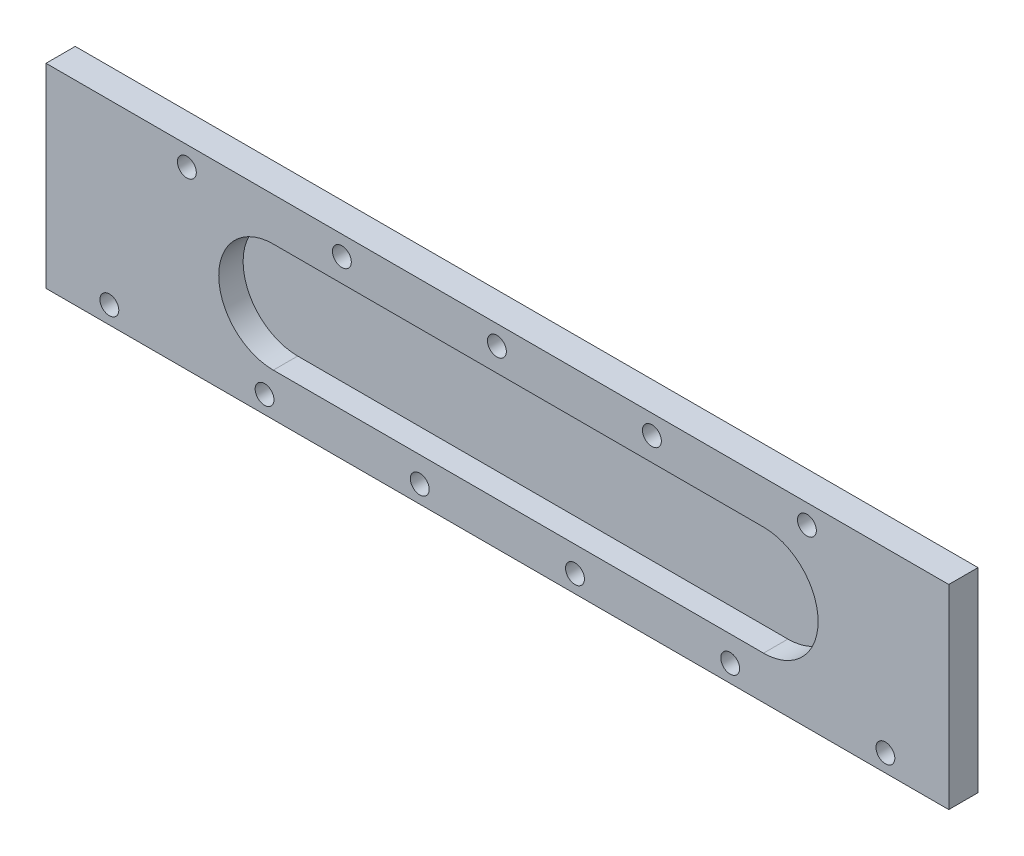
ISO-10303-21;
HEADER;
FILE_DESCRIPTION(('STEP AP214'),'2;1');
FILE_NAME('part.step','',(''),(''),'','','');
FILE_SCHEMA(('AUTOMOTIVE_DESIGN { 1 0 10303 214 1 1 1 1 }'));
ENDSEC;
DATA;
#1=APPLICATION_CONTEXT('core data for automotive mechanical design processes');
#2=APPLICATION_PROTOCOL_DEFINITION('international standard','automotive_design',2000,#1);
#3=PRODUCT_CONTEXT('',#1,'mechanical');
#4=PRODUCT('Part','Part','',(#3));
#5=PRODUCT_RELATED_PRODUCT_CATEGORY('part','',(#4));
#6=PRODUCT_DEFINITION_FORMATION('','',#4);
#7=PRODUCT_DEFINITION_CONTEXT('part definition',#1,'design');
#8=PRODUCT_DEFINITION('design','',#6,#7);
#9=PRODUCT_DEFINITION_SHAPE('','',#8);
#10=(LENGTH_UNIT() NAMED_UNIT(*) SI_UNIT(.MILLI.,.METRE.));
#11=(NAMED_UNIT(*) PLANE_ANGLE_UNIT() SI_UNIT($,.RADIAN.));
#12=(NAMED_UNIT(*) SI_UNIT($,.STERADIAN.) SOLID_ANGLE_UNIT());
#13=UNCERTAINTY_MEASURE_WITH_UNIT(LENGTH_MEASURE(1.E-05),#10,'distance_accuracy_value','');
#14=(GEOMETRIC_REPRESENTATION_CONTEXT(3) GLOBAL_UNCERTAINTY_ASSIGNED_CONTEXT((#13)) GLOBAL_UNIT_ASSIGNED_CONTEXT((#10,
#11,#12)) REPRESENTATION_CONTEXT('',''));
#15=CARTESIAN_POINT('',(0.,0.,0.));
#16=DIRECTION('',(0.,0.,1.));
#17=DIRECTION('',(1.,0.,0.));
#18=AXIS2_PLACEMENT_3D('',#15,#16,#17);
#19=CARTESIAN_POINT('',(0.,0.,7.62));
#20=DIRECTION('',(-1.,0.,0.));
#21=DIRECTION('',(0.,0.,1.));
#22=AXIS2_PLACEMENT_3D('',#19,#20,#21);
#23=PLANE('',#22);
#24=DIRECTION('',(0.,1.,0.));
#25=VECTOR('',#24,1.);
#26=CARTESIAN_POINT('',(0.,0.,0.));
#27=LINE('',#26,#25);
#28=CARTESIAN_POINT('',(0.,0.,0.));
#29=VERTEX_POINT('',#28);
#30=CARTESIAN_POINT('',(0.,50.8,0.));
#31=VERTEX_POINT('',#30);
#32=EDGE_CURVE('E143',#29,#31,#27,.T.);
#33=ORIENTED_EDGE('',*,*,#32,.T.);
#34=DIRECTION('',(0.,0.,-1.));
#35=VECTOR('',#34,1.);
#36=CARTESIAN_POINT('',(0.,50.8,7.62));
#37=LINE('',#36,#35);
#38=CARTESIAN_POINT('',(0.,50.8,7.62));
#39=VERTEX_POINT('',#38);
#40=EDGE_CURVE('E11',#39,#31,#37,.T.);
#41=ORIENTED_EDGE('',*,*,#40,.F.);
#42=DIRECTION('',(0.,1.,0.));
#43=VECTOR('',#42,1.);
#44=CARTESIAN_POINT('',(0.,0.,7.62));
#45=LINE('',#44,#43);
#46=CARTESIAN_POINT('',(0.,0.,7.62));
#47=VERTEX_POINT('',#46);
#48=EDGE_CURVE('E147',#47,#39,#45,.T.);
#49=ORIENTED_EDGE('',*,*,#48,.F.);
#50=DIRECTION('',(0.,0.,-1.));
#51=VECTOR('',#50,1.);
#52=CARTESIAN_POINT('',(0.,0.,7.62));
#53=LINE('',#52,#51);
#54=EDGE_CURVE('E153',#47,#29,#53,.T.);
#55=ORIENTED_EDGE('',*,*,#54,.T.);
#56=EDGE_LOOP('',(#33,#41,#49,#55));
#57=FACE_BOUND('',#56,.T.);
#58=ADVANCED_FACE('F32',(#57),#23,.F.);
#59=CARTESIAN_POINT('',(0.,50.8,7.62));
#60=DIRECTION('',(0.,-1.,0.));
#61=DIRECTION('',(1.,0.,0.));
#62=AXIS2_PLACEMENT_3D('',#59,#60,#61);
#63=PLANE('',#62);
#64=DIRECTION('',(-1.,0.,0.));
#65=VECTOR('',#64,1.);
#66=CARTESIAN_POINT('',(0.,50.8,0.));
#67=LINE('',#66,#65);
#68=CARTESIAN_POINT('',(-235.204,50.8,0.));
#69=VERTEX_POINT('',#68);
#70=EDGE_CURVE('E156',#31,#69,#67,.T.);
#71=ORIENTED_EDGE('',*,*,#70,.T.);
#72=DIRECTION('',(0.,0.,-1.));
#73=VECTOR('',#72,1.);
#74=CARTESIAN_POINT('',(-235.204,50.8,7.62));
#75=LINE('',#74,#73);
#76=CARTESIAN_POINT('',(-235.204,50.8,7.62));
#77=VERTEX_POINT('',#76);
#78=EDGE_CURVE('E39',#77,#69,#75,.T.);
#79=ORIENTED_EDGE('',*,*,#78,.F.);
#80=DIRECTION('',(-1.,0.,0.));
#81=VECTOR('',#80,1.);
#82=CARTESIAN_POINT('',(0.,50.8,7.62));
#83=LINE('',#82,#81);
#84=EDGE_CURVE('E83',#39,#77,#83,.T.);
#85=ORIENTED_EDGE('',*,*,#84,.F.);
#86=ORIENTED_EDGE('',*,*,#40,.T.);
#87=EDGE_LOOP('',(#71,#79,#85,#86));
#88=FACE_BOUND('',#87,.T.);
#89=ADVANCED_FACE('F185',(#88),#63,.F.);
#90=CARTESIAN_POINT('',(-235.204,0.,7.62));
#91=DIRECTION('',(1.,0.,0.));
#92=DIRECTION('',(0.,0.,-1.));
#93=AXIS2_PLACEMENT_3D('',#90,#91,#92);
#94=PLANE('',#93);
#95=DIRECTION('',(0.,-1.,0.));
#96=VECTOR('',#95,1.);
#97=CARTESIAN_POINT('',(-235.204,0.,0.));
#98=LINE('',#97,#96);
#99=CARTESIAN_POINT('',(-235.204,0.,0.));
#100=VERTEX_POINT('',#99);
#101=EDGE_CURVE('E158',#69,#100,#98,.T.);
#102=ORIENTED_EDGE('',*,*,#101,.T.);
#103=DIRECTION('',(0.,0.,-1.));
#104=VECTOR('',#103,1.);
#105=CARTESIAN_POINT('',(-235.204,0.,7.62));
#106=LINE('',#105,#104);
#107=CARTESIAN_POINT('',(-235.204,0.,7.62));
#108=VERTEX_POINT('',#107);
#109=EDGE_CURVE('E162',#108,#100,#106,.T.);
#110=ORIENTED_EDGE('',*,*,#109,.F.);
#111=DIRECTION('',(0.,-1.,0.));
#112=VECTOR('',#111,1.);
#113=CARTESIAN_POINT('',(-235.204,0.,7.62));
#114=LINE('',#113,#112);
#115=EDGE_CURVE('E150',#77,#108,#114,.T.);
#116=ORIENTED_EDGE('',*,*,#115,.F.);
#117=ORIENTED_EDGE('',*,*,#78,.T.);
#118=EDGE_LOOP('',(#102,#110,#116,#117));
#119=FACE_BOUND('',#118,.T.);
#120=ADVANCED_FACE('F167',(#119),#94,.F.);
#121=CARTESIAN_POINT('',(0.,0.,7.62));
#122=DIRECTION('',(0.,1.,0.));
#123=DIRECTION('',(-1.,0.,0.));
#124=AXIS2_PLACEMENT_3D('',#121,#122,#123);
#125=PLANE('',#124);
#126=DIRECTION('',(1.,0.,0.));
#127=VECTOR('',#126,1.);
#128=CARTESIAN_POINT('',(0.,0.,0.));
#129=LINE('',#128,#127);
#130=EDGE_CURVE('E76',#100,#29,#129,.T.);
#131=ORIENTED_EDGE('',*,*,#130,.T.);
#132=ORIENTED_EDGE('',*,*,#54,.F.);
#133=DIRECTION('',(1.,0.,0.));
#134=VECTOR('',#133,1.);
#135=CARTESIAN_POINT('',(0.,0.,7.62));
#136=LINE('',#135,#134);
#137=EDGE_CURVE('E55',#108,#47,#136,.T.);
#138=ORIENTED_EDGE('',*,*,#137,.F.);
#139=ORIENTED_EDGE('',*,*,#109,.T.);
#140=EDGE_LOOP('',(#131,#132,#138,#139));
#141=FACE_BOUND('',#140,.T.);
#142=ADVANCED_FACE('F175',(#141),#125,.F.);
#143=CARTESIAN_POINT('',(0.,0.,7.62));
#144=DIRECTION('',(0.,0.,1.));
#145=DIRECTION('',(1.,0.,0.));
#146=AXIS2_PLACEMENT_3D('',#143,#144,#145);
#147=PLANE('',#146);
#148=CARTESIAN_POINT('',(-198.501,45.72,7.62));
#149=DIRECTION('',(0.,0.,1.));
#150=DIRECTION('',(1.,0.,0.));
#151=AXIS2_PLACEMENT_3D('',#148,#149,#150);
#152=CIRCLE('',#151,2.45745);
#153=CARTESIAN_POINT('',(-196.04355,45.72,7.62));
#154=VERTEX_POINT('',#153);
#155=EDGE_CURVE('E380',#154,#154,#152,.T.);
#156=ORIENTED_EDGE('',*,*,#155,.F.);
#157=EDGE_LOOP('',(#156));
#158=FACE_BOUND('',#157,.T.);
#159=CARTESIAN_POINT('',(-158.115,45.72,7.62));
#160=DIRECTION('',(0.,0.,1.));
#161=DIRECTION('',(1.,0.,0.));
#162=AXIS2_PLACEMENT_3D('',#159,#160,#161);
#163=CIRCLE('',#162,2.45745);
#164=CARTESIAN_POINT('',(-155.65755,45.72,7.62));
#165=VERTEX_POINT('',#164);
#166=EDGE_CURVE('E382',#165,#165,#163,.T.);
#167=ORIENTED_EDGE('',*,*,#166,.F.);
#168=EDGE_LOOP('',(#167));
#169=FACE_BOUND('',#168,.T.);
#170=CARTESIAN_POINT('',(-117.729,45.72,7.62));
#171=DIRECTION('',(0.,0.,1.));
#172=DIRECTION('',(1.,0.,0.));
#173=AXIS2_PLACEMENT_3D('',#170,#171,#172);
#174=CIRCLE('',#173,2.45744999999999);
#175=CARTESIAN_POINT('',(-115.27155,45.72,7.62));
#176=VERTEX_POINT('',#175);
#177=EDGE_CURVE('E390',#176,#176,#174,.T.);
#178=ORIENTED_EDGE('',*,*,#177,.F.);
#179=EDGE_LOOP('',(#178));
#180=FACE_BOUND('',#179,.T.);
#181=CARTESIAN_POINT('',(-77.343,45.72,7.62));
#182=DIRECTION('',(0.,0.,1.));
#183=DIRECTION('',(1.,0.,0.));
#184=AXIS2_PLACEMENT_3D('',#181,#182,#183);
#185=CIRCLE('',#184,2.45744999999999);
#186=CARTESIAN_POINT('',(-74.88555,45.72,7.62));
#187=VERTEX_POINT('',#186);
#188=EDGE_CURVE('E396',#187,#187,#185,.T.);
#189=ORIENTED_EDGE('',*,*,#188,.F.);
#190=EDGE_LOOP('',(#189));
#191=FACE_BOUND('',#190,.T.);
#192=CARTESIAN_POINT('',(-36.957,45.72,7.62));
#193=DIRECTION('',(0.,0.,1.));
#194=DIRECTION('',(1.,0.,0.));
#195=AXIS2_PLACEMENT_3D('',#192,#193,#194);
#196=CIRCLE('',#195,2.45744999999999);
#197=CARTESIAN_POINT('',(-34.49955,45.72,7.62));
#198=VERTEX_POINT('',#197);
#199=EDGE_CURVE('E402',#198,#198,#196,.T.);
#200=ORIENTED_EDGE('',*,*,#199,.F.);
#201=EDGE_LOOP('',(#200));
#202=FACE_BOUND('',#201,.T.);
#203=CARTESIAN_POINT('',(-218.694,4.54847930763691,7.62));
#204=DIRECTION('',(0.,0.,1.));
#205=DIRECTION('',(1.,0.,0.));
#206=AXIS2_PLACEMENT_3D('',#203,#204,#205);
#207=CIRCLE('',#206,2.45745);
#208=CARTESIAN_POINT('',(-216.23655,4.54847930763691,7.62));
#209=VERTEX_POINT('',#208);
#210=EDGE_CURVE('E408',#209,#209,#207,.T.);
#211=ORIENTED_EDGE('',*,*,#210,.F.);
#212=EDGE_LOOP('',(#211));
#213=FACE_BOUND('',#212,.T.);
#214=CARTESIAN_POINT('',(-178.2572,4.54847930763691,7.62));
#215=DIRECTION('',(0.,0.,1.));
#216=DIRECTION('',(1.,0.,0.));
#217=AXIS2_PLACEMENT_3D('',#214,#215,#216);
#218=CIRCLE('',#217,2.45745);
#219=CARTESIAN_POINT('',(-175.79975,4.54847930763691,7.62));
#220=VERTEX_POINT('',#219);
#221=EDGE_CURVE('E414',#220,#220,#218,.T.);
#222=ORIENTED_EDGE('',*,*,#221,.F.);
#223=EDGE_LOOP('',(#222));
#224=FACE_BOUND('',#223,.T.);
#225=CARTESIAN_POINT('',(-137.8204,4.54847930763691,7.62));
#226=DIRECTION('',(0.,0.,1.));
#227=DIRECTION('',(1.,0.,0.));
#228=AXIS2_PLACEMENT_3D('',#225,#226,#227);
#229=CIRCLE('',#228,2.45745);
#230=CARTESIAN_POINT('',(-135.36295,4.54847930763691,7.62));
#231=VERTEX_POINT('',#230);
#232=EDGE_CURVE('E420',#231,#231,#229,.T.);
#233=ORIENTED_EDGE('',*,*,#232,.F.);
#234=EDGE_LOOP('',(#233));
#235=FACE_BOUND('',#234,.T.);
#236=CARTESIAN_POINT('',(-97.3836,4.54847930763691,7.62));
#237=DIRECTION('',(0.,0.,1.));
#238=DIRECTION('',(1.,0.,0.));
#239=AXIS2_PLACEMENT_3D('',#236,#237,#238);
#240=CIRCLE('',#239,2.45744999999999);
#241=CARTESIAN_POINT('',(-94.92615,4.54847930763691,7.62));
#242=VERTEX_POINT('',#241);
#243=EDGE_CURVE('E426',#242,#242,#240,.T.);
#244=ORIENTED_EDGE('',*,*,#243,.F.);
#245=EDGE_LOOP('',(#244));
#246=FACE_BOUND('',#245,.T.);
#247=CARTESIAN_POINT('',(-56.9468,4.54847930763691,7.62));
#248=DIRECTION('',(0.,0.,1.));
#249=DIRECTION('',(1.,0.,0.));
#250=AXIS2_PLACEMENT_3D('',#247,#248,#249);
#251=CIRCLE('',#250,2.45744999999999);
#252=CARTESIAN_POINT('',(-54.48935,4.54847930763691,7.62));
#253=VERTEX_POINT('',#252);
#254=EDGE_CURVE('E432',#253,#253,#251,.T.);
#255=ORIENTED_EDGE('',*,*,#254,.F.);
#256=EDGE_LOOP('',(#255));
#257=FACE_BOUND('',#256,.T.);
#258=CARTESIAN_POINT('',(-16.51,4.54847930763691,7.62));
#259=DIRECTION('',(0.,0.,1.));
#260=DIRECTION('',(1.,0.,0.));
#261=AXIS2_PLACEMENT_3D('',#258,#259,#260);
#262=CIRCLE('',#261,2.45744999999999);
#263=CARTESIAN_POINT('',(-14.05255,4.54847930763691,7.62));
#264=VERTEX_POINT('',#263);
#265=EDGE_CURVE('E437',#264,#264,#262,.T.);
#266=ORIENTED_EDGE('',*,*,#265,.F.);
#267=EDGE_LOOP('',(#266));
#268=FACE_BOUND('',#267,.T.);
#269=CARTESIAN_POINT('',(-48.26,25.4,7.62));
#270=DIRECTION('',(0.,0.,1.));
#271=DIRECTION('',(1.,0.,0.));
#272=AXIS2_PLACEMENT_3D('',#269,#270,#271);
#273=CIRCLE('',#272,14.224);
#274=CARTESIAN_POINT('',(-48.26,11.176,7.62));
#275=VERTEX_POINT('',#274);
#276=CARTESIAN_POINT('',(-48.26,39.624,7.62));
#277=VERTEX_POINT('',#276);
#278=EDGE_CURVE('E46',#275,#277,#273,.T.);
#279=ORIENTED_EDGE('',*,*,#278,.F.);
#280=DIRECTION('',(1.,0.,0.));
#281=VECTOR('',#280,1.);
#282=CARTESIAN_POINT('',(-48.26,11.176,7.62));
#283=LINE('',#282,#281);
#284=CARTESIAN_POINT('',(-175.975043584401,11.176,7.62));
#285=VERTEX_POINT('',#284);
#286=EDGE_CURVE('E125',#285,#275,#283,.T.);
#287=ORIENTED_EDGE('',*,*,#286,.F.);
#288=CARTESIAN_POINT('',(-175.975043584401,25.4,7.62));
#289=DIRECTION('',(0.,0.,1.));
#290=DIRECTION('',(1.,0.,0.));
#291=AXIS2_PLACEMENT_3D('',#288,#289,#290);
#292=CIRCLE('',#291,14.224);
#293=CARTESIAN_POINT('',(-175.975043584401,39.624,7.62));
#294=VERTEX_POINT('',#293);
#295=EDGE_CURVE('E128',#294,#285,#292,.T.);
#296=ORIENTED_EDGE('',*,*,#295,.F.);
#297=DIRECTION('',(-1.,0.,0.));
#298=VECTOR('',#297,1.);
#299=CARTESIAN_POINT('',(-48.26,39.624,7.62));
#300=LINE('',#299,#298);
#301=EDGE_CURVE('E137',#277,#294,#300,.T.);
#302=ORIENTED_EDGE('',*,*,#301,.F.);
#303=EDGE_LOOP('',(#279,#287,#296,#302));
#304=FACE_BOUND('',#303,.T.);
#305=ORIENTED_EDGE('',*,*,#48,.T.);
#306=ORIENTED_EDGE('',*,*,#84,.T.);
#307=ORIENTED_EDGE('',*,*,#115,.T.);
#308=ORIENTED_EDGE('',*,*,#137,.T.);
#309=EDGE_LOOP('',(#305,#306,#307,#308));
#310=FACE_BOUND('',#309,.T.);
#311=ADVANCED_FACE('F177',(#158,#169,#180,#191,#202,#213,#224,#235,#246,#257,#268,#304,#310),
#147,.T.);
#312=CARTESIAN_POINT('',(0.,0.,0.));
#313=DIRECTION('',(0.,0.,1.));
#314=DIRECTION('',(1.,0.,0.));
#315=AXIS2_PLACEMENT_3D('',#312,#313,#314);
#316=PLANE('',#315);
#317=CARTESIAN_POINT('',(-198.501,45.72,0.));
#318=DIRECTION('',(0.,0.,1.));
#319=DIRECTION('',(1.,0.,0.));
#320=AXIS2_PLACEMENT_3D('',#317,#318,#319);
#321=CIRCLE('',#320,2.45745);
#322=CARTESIAN_POINT('',(-196.04355,45.72,0.));
#323=VERTEX_POINT('',#322);
#324=EDGE_CURVE('E377',#323,#323,#321,.T.);
#325=ORIENTED_EDGE('',*,*,#324,.T.);
#326=EDGE_LOOP('',(#325));
#327=FACE_BOUND('',#326,.T.);
#328=CARTESIAN_POINT('',(-158.115,45.72,0.));
#329=DIRECTION('',(0.,0.,1.));
#330=DIRECTION('',(1.,0.,0.));
#331=AXIS2_PLACEMENT_3D('',#328,#329,#330);
#332=CIRCLE('',#331,2.45745);
#333=CARTESIAN_POINT('',(-155.65755,45.72,0.));
#334=VERTEX_POINT('',#333);
#335=EDGE_CURVE('E387',#334,#334,#332,.T.);
#336=ORIENTED_EDGE('',*,*,#335,.T.);
#337=EDGE_LOOP('',(#336));
#338=FACE_BOUND('',#337,.T.);
#339=CARTESIAN_POINT('',(-117.729,45.72,0.));
#340=DIRECTION('',(0.,0.,1.));
#341=DIRECTION('',(1.,0.,0.));
#342=AXIS2_PLACEMENT_3D('',#339,#340,#341);
#343=CIRCLE('',#342,2.45745);
#344=CARTESIAN_POINT('',(-115.27155,45.72,0.));
#345=VERTEX_POINT('',#344);
#346=EDGE_CURVE('E393',#345,#345,#343,.T.);
#347=ORIENTED_EDGE('',*,*,#346,.T.);
#348=EDGE_LOOP('',(#347));
#349=FACE_BOUND('',#348,.T.);
#350=CARTESIAN_POINT('',(-77.343,45.72,0.));
#351=DIRECTION('',(0.,0.,1.));
#352=DIRECTION('',(1.,0.,0.));
#353=AXIS2_PLACEMENT_3D('',#350,#351,#352);
#354=CIRCLE('',#353,2.45745);
#355=CARTESIAN_POINT('',(-74.88555,45.72,0.));
#356=VERTEX_POINT('',#355);
#357=EDGE_CURVE('E399',#356,#356,#354,.T.);
#358=ORIENTED_EDGE('',*,*,#357,.T.);
#359=EDGE_LOOP('',(#358));
#360=FACE_BOUND('',#359,.T.);
#361=CARTESIAN_POINT('',(-36.957,45.72,0.));
#362=DIRECTION('',(0.,0.,1.));
#363=DIRECTION('',(1.,0.,0.));
#364=AXIS2_PLACEMENT_3D('',#361,#362,#363);
#365=CIRCLE('',#364,2.45745);
#366=CARTESIAN_POINT('',(-34.49955,45.72,0.));
#367=VERTEX_POINT('',#366);
#368=EDGE_CURVE('E405',#367,#367,#365,.T.);
#369=ORIENTED_EDGE('',*,*,#368,.T.);
#370=EDGE_LOOP('',(#369));
#371=FACE_BOUND('',#370,.T.);
#372=CARTESIAN_POINT('',(-218.694,4.54847930763691,0.));
#373=DIRECTION('',(0.,0.,1.));
#374=DIRECTION('',(1.,0.,0.));
#375=AXIS2_PLACEMENT_3D('',#372,#373,#374);
#376=CIRCLE('',#375,2.45745);
#377=CARTESIAN_POINT('',(-216.23655,4.54847930763691,0.));
#378=VERTEX_POINT('',#377);
#379=EDGE_CURVE('E411',#378,#378,#376,.T.);
#380=ORIENTED_EDGE('',*,*,#379,.T.);
#381=EDGE_LOOP('',(#380));
#382=FACE_BOUND('',#381,.T.);
#383=CARTESIAN_POINT('',(-178.2572,4.54847930763691,0.));
#384=DIRECTION('',(0.,0.,1.));
#385=DIRECTION('',(1.,0.,0.));
#386=AXIS2_PLACEMENT_3D('',#383,#384,#385);
#387=CIRCLE('',#386,2.45745);
#388=CARTESIAN_POINT('',(-175.79975,4.54847930763691,0.));
#389=VERTEX_POINT('',#388);
#390=EDGE_CURVE('E417',#389,#389,#387,.T.);
#391=ORIENTED_EDGE('',*,*,#390,.T.);
#392=EDGE_LOOP('',(#391));
#393=FACE_BOUND('',#392,.T.);
#394=CARTESIAN_POINT('',(-137.8204,4.54847930763691,0.));
#395=DIRECTION('',(0.,0.,1.));
#396=DIRECTION('',(1.,0.,0.));
#397=AXIS2_PLACEMENT_3D('',#394,#395,#396);
#398=CIRCLE('',#397,2.45745);
#399=CARTESIAN_POINT('',(-135.36295,4.54847930763691,0.));
#400=VERTEX_POINT('',#399);
#401=EDGE_CURVE('E423',#400,#400,#398,.T.);
#402=ORIENTED_EDGE('',*,*,#401,.T.);
#403=EDGE_LOOP('',(#402));
#404=FACE_BOUND('',#403,.T.);
#405=CARTESIAN_POINT('',(-97.3836,4.54847930763691,0.));
#406=DIRECTION('',(0.,0.,1.));
#407=DIRECTION('',(1.,0.,0.));
#408=AXIS2_PLACEMENT_3D('',#405,#406,#407);
#409=CIRCLE('',#408,2.45745);
#410=CARTESIAN_POINT('',(-94.92615,4.54847930763691,0.));
#411=VERTEX_POINT('',#410);
#412=EDGE_CURVE('E429',#411,#411,#409,.T.);
#413=ORIENTED_EDGE('',*,*,#412,.T.);
#414=EDGE_LOOP('',(#413));
#415=FACE_BOUND('',#414,.T.);
#416=CARTESIAN_POINT('',(-56.9468,4.54847930763691,0.));
#417=DIRECTION('',(0.,0.,1.));
#418=DIRECTION('',(1.,0.,0.));
#419=AXIS2_PLACEMENT_3D('',#416,#417,#418);
#420=CIRCLE('',#419,2.45745);
#421=CARTESIAN_POINT('',(-54.48935,4.54847930763691,0.));
#422=VERTEX_POINT('',#421);
#423=EDGE_CURVE('E435',#422,#422,#420,.T.);
#424=ORIENTED_EDGE('',*,*,#423,.T.);
#425=EDGE_LOOP('',(#424));
#426=FACE_BOUND('',#425,.T.);
#427=CARTESIAN_POINT('',(-16.51,4.54847930763691,0.));
#428=DIRECTION('',(0.,0.,1.));
#429=DIRECTION('',(1.,0.,0.));
#430=AXIS2_PLACEMENT_3D('',#427,#428,#429);
#431=CIRCLE('',#430,2.45745);
#432=CARTESIAN_POINT('',(-14.05255,4.54847930763691,0.));
#433=VERTEX_POINT('',#432);
#434=EDGE_CURVE('E131',#433,#433,#431,.T.);
#435=ORIENTED_EDGE('',*,*,#434,.T.);
#436=EDGE_LOOP('',(#435));
#437=FACE_BOUND('',#436,.T.);
#438=ORIENTED_EDGE('',*,*,#32,.F.);
#439=ORIENTED_EDGE('',*,*,#130,.F.);
#440=ORIENTED_EDGE('',*,*,#101,.F.);
#441=ORIENTED_EDGE('',*,*,#70,.F.);
#442=EDGE_LOOP('',(#438,#439,#440,#441));
#443=FACE_BOUND('',#442,.T.);
#444=ADVANCED_FACE('F171',(#327,#338,#349,#360,#371,#382,#393,#404,#415,#426,#437,#443),#316,.F.);
#445=CARTESIAN_POINT('',(-48.26,25.4,1.27));
#446=DIRECTION('',(0.,0.,1.));
#447=DIRECTION('',(1.,0.,0.));
#448=AXIS2_PLACEMENT_3D('',#445,#446,#447);
#449=CYLINDRICAL_SURFACE('',#448,14.224);
#450=ORIENTED_EDGE('',*,*,#278,.T.);
#451=DIRECTION('',(0.,0.,1.));
#452=VECTOR('',#451,1.);
#453=CARTESIAN_POINT('',(-48.26,39.624,1.27));
#454=LINE('',#453,#452);
#455=CARTESIAN_POINT('',(-48.26,39.624,1.27));
#456=VERTEX_POINT('',#455);
#457=EDGE_CURVE('E103',#456,#277,#454,.T.);
#458=ORIENTED_EDGE('',*,*,#457,.F.);
#459=CARTESIAN_POINT('',(-48.26,25.4,1.27));
#460=DIRECTION('',(0.,0.,1.));
#461=DIRECTION('',(1.,0.,0.));
#462=AXIS2_PLACEMENT_3D('',#459,#460,#461);
#463=CIRCLE('',#462,14.224);
#464=CARTESIAN_POINT('',(-48.26,11.176,1.27));
#465=VERTEX_POINT('',#464);
#466=EDGE_CURVE('E107',#465,#456,#463,.T.);
#467=ORIENTED_EDGE('',*,*,#466,.F.);
#468=DIRECTION('',(0.,0.,1.));
#469=VECTOR('',#468,1.);
#470=CARTESIAN_POINT('',(-48.26,11.176,1.27));
#471=LINE('',#470,#469);
#472=EDGE_CURVE('E141',#465,#275,#471,.T.);
#473=ORIENTED_EDGE('',*,*,#472,.T.);
#474=EDGE_LOOP('',(#450,#458,#467,#473));
#475=FACE_BOUND('',#474,.T.);
#476=ADVANCED_FACE('F105',(#475),#449,.F.);
#477=CARTESIAN_POINT('',(-48.26,11.176,1.27));
#478=DIRECTION('',(0.,-1.,0.));
#479=DIRECTION('',(0.,0.,-1.));
#480=AXIS2_PLACEMENT_3D('',#477,#478,#479);
#481=PLANE('',#480);
#482=ORIENTED_EDGE('',*,*,#286,.T.);
#483=ORIENTED_EDGE('',*,*,#472,.F.);
#484=DIRECTION('',(1.,0.,0.));
#485=VECTOR('',#484,1.);
#486=CARTESIAN_POINT('',(-48.26,11.176,1.27));
#487=LINE('',#486,#485);
#488=CARTESIAN_POINT('',(-175.975043584401,11.176,1.27));
#489=VERTEX_POINT('',#488);
#490=EDGE_CURVE('E113',#489,#465,#487,.T.);
#491=ORIENTED_EDGE('',*,*,#490,.F.);
#492=DIRECTION('',(0.,0.,1.));
#493=VECTOR('',#492,1.);
#494=CARTESIAN_POINT('',(-175.975043584401,11.176,1.27));
#495=LINE('',#494,#493);
#496=EDGE_CURVE('E144',#489,#285,#495,.T.);
#497=ORIENTED_EDGE('',*,*,#496,.T.);
#498=EDGE_LOOP('',(#482,#483,#491,#497));
#499=FACE_BOUND('',#498,.T.);
#500=ADVANCED_FACE('F212',(#499),#481,.F.);
#501=CARTESIAN_POINT('',(-175.975043584401,25.4,1.27));
#502=DIRECTION('',(0.,0.,1.));
#503=DIRECTION('',(1.,0.,0.));
#504=AXIS2_PLACEMENT_3D('',#501,#502,#503);
#505=CYLINDRICAL_SURFACE('',#504,14.224);
#506=ORIENTED_EDGE('',*,*,#295,.T.);
#507=ORIENTED_EDGE('',*,*,#496,.F.);
#508=CARTESIAN_POINT('',(-175.975043584401,25.4,1.27));
#509=DIRECTION('',(0.,0.,1.));
#510=DIRECTION('',(1.,0.,0.));
#511=AXIS2_PLACEMENT_3D('',#508,#509,#510);
#512=CIRCLE('',#511,14.224);
#513=CARTESIAN_POINT('',(-175.975043584401,39.624,1.27));
#514=VERTEX_POINT('',#513);
#515=EDGE_CURVE('E121',#514,#489,#512,.T.);
#516=ORIENTED_EDGE('',*,*,#515,.F.);
#517=DIRECTION('',(0.,0.,1.));
#518=VECTOR('',#517,1.);
#519=CARTESIAN_POINT('',(-175.975043584401,39.624,1.27));
#520=LINE('',#519,#518);
#521=EDGE_CURVE('E112',#514,#294,#520,.T.);
#522=ORIENTED_EDGE('',*,*,#521,.T.);
#523=EDGE_LOOP('',(#506,#507,#516,#522));
#524=FACE_BOUND('',#523,.T.);
#525=ADVANCED_FACE('F223',(#524),#505,.F.);
#526=CARTESIAN_POINT('',(-48.26,39.624,1.27));
#527=DIRECTION('',(0.,1.,0.));
#528=DIRECTION('',(0.,0.,1.));
#529=AXIS2_PLACEMENT_3D('',#526,#527,#528);
#530=PLANE('',#529);
#531=ORIENTED_EDGE('',*,*,#301,.T.);
#532=ORIENTED_EDGE('',*,*,#521,.F.);
#533=DIRECTION('',(-1.,0.,0.));
#534=VECTOR('',#533,1.);
#535=CARTESIAN_POINT('',(-48.26,39.624,1.27));
#536=LINE('',#535,#534);
#537=EDGE_CURVE('E116',#456,#514,#536,.T.);
#538=ORIENTED_EDGE('',*,*,#537,.F.);
#539=ORIENTED_EDGE('',*,*,#457,.T.);
#540=EDGE_LOOP('',(#531,#532,#538,#539));
#541=FACE_BOUND('',#540,.T.);
#542=ADVANCED_FACE('F117',(#541),#530,.F.);
#543=CARTESIAN_POINT('',(-48.26,25.4,1.27));
#544=DIRECTION('',(0.,0.,1.));
#545=DIRECTION('',(1.,0.,0.));
#546=AXIS2_PLACEMENT_3D('',#543,#544,#545);
#547=PLANE('',#546);
#548=ORIENTED_EDGE('',*,*,#466,.T.);
#549=ORIENTED_EDGE('',*,*,#537,.T.);
#550=ORIENTED_EDGE('',*,*,#515,.T.);
#551=ORIENTED_EDGE('',*,*,#490,.T.);
#552=EDGE_LOOP('',(#548,#549,#550,#551));
#553=FACE_BOUND('',#552,.T.);
#554=ADVANCED_FACE('F123',(#553),#547,.T.);
#555=CARTESIAN_POINT('',(-16.51,4.54847930763691,7.62));
#556=DIRECTION('',(0.,0.,1.));
#557=DIRECTION('',(1.,0.,0.));
#558=AXIS2_PLACEMENT_3D('',#555,#556,#557);
#559=CYLINDRICAL_SURFACE('',#558,2.45744999999999);
#560=ORIENTED_EDGE('',*,*,#434,.F.);
#561=EDGE_LOOP('',(#560));
#562=FACE_BOUND('',#561,.T.);
#563=ORIENTED_EDGE('',*,*,#265,.T.);
#564=EDGE_LOOP('',(#563));
#565=FACE_BOUND('',#564,.T.);
#566=ADVANCED_FACE('F250',(#562,#565),#559,.F.);
#567=CARTESIAN_POINT('',(-56.9468,4.54847930763691,7.62));
#568=DIRECTION('',(0.,0.,1.));
#569=DIRECTION('',(1.,0.,0.));
#570=AXIS2_PLACEMENT_3D('',#567,#568,#569);
#571=CYLINDRICAL_SURFACE('',#570,2.45744999999999);
#572=ORIENTED_EDGE('',*,*,#423,.F.);
#573=EDGE_LOOP('',(#572));
#574=FACE_BOUND('',#573,.T.);
#575=ORIENTED_EDGE('',*,*,#254,.T.);
#576=EDGE_LOOP('',(#575));
#577=FACE_BOUND('',#576,.T.);
#578=ADVANCED_FACE('F270',(#574,#577),#571,.F.);
#579=CARTESIAN_POINT('',(-97.3836,4.54847930763691,7.62));
#580=DIRECTION('',(0.,0.,1.));
#581=DIRECTION('',(1.,0.,0.));
#582=AXIS2_PLACEMENT_3D('',#579,#580,#581);
#583=CYLINDRICAL_SURFACE('',#582,2.45744999999999);
#584=ORIENTED_EDGE('',*,*,#412,.F.);
#585=EDGE_LOOP('',(#584));
#586=FACE_BOUND('',#585,.T.);
#587=ORIENTED_EDGE('',*,*,#243,.T.);
#588=EDGE_LOOP('',(#587));
#589=FACE_BOUND('',#588,.T.);
#590=ADVANCED_FACE('F280',(#586,#589),#583,.F.);
#591=CARTESIAN_POINT('',(-137.8204,4.54847930763691,7.62));
#592=DIRECTION('',(0.,0.,1.));
#593=DIRECTION('',(1.,0.,0.));
#594=AXIS2_PLACEMENT_3D('',#591,#592,#593);
#595=CYLINDRICAL_SURFACE('',#594,2.45745);
#596=ORIENTED_EDGE('',*,*,#401,.F.);
#597=EDGE_LOOP('',(#596));
#598=FACE_BOUND('',#597,.T.);
#599=ORIENTED_EDGE('',*,*,#232,.T.);
#600=EDGE_LOOP('',(#599));
#601=FACE_BOUND('',#600,.T.);
#602=ADVANCED_FACE('F290',(#598,#601),#595,.F.);
#603=CARTESIAN_POINT('',(-178.2572,4.54847930763691,7.62));
#604=DIRECTION('',(0.,0.,1.));
#605=DIRECTION('',(1.,0.,0.));
#606=AXIS2_PLACEMENT_3D('',#603,#604,#605);
#607=CYLINDRICAL_SURFACE('',#606,2.45745);
#608=ORIENTED_EDGE('',*,*,#390,.F.);
#609=EDGE_LOOP('',(#608));
#610=FACE_BOUND('',#609,.T.);
#611=ORIENTED_EDGE('',*,*,#221,.T.);
#612=EDGE_LOOP('',(#611));
#613=FACE_BOUND('',#612,.T.);
#614=ADVANCED_FACE('F300',(#610,#613),#607,.F.);
#615=CARTESIAN_POINT('',(-218.694,4.54847930763691,7.62));
#616=DIRECTION('',(0.,0.,1.));
#617=DIRECTION('',(1.,0.,0.));
#618=AXIS2_PLACEMENT_3D('',#615,#616,#617);
#619=CYLINDRICAL_SURFACE('',#618,2.45745);
#620=ORIENTED_EDGE('',*,*,#379,.F.);
#621=EDGE_LOOP('',(#620));
#622=FACE_BOUND('',#621,.T.);
#623=ORIENTED_EDGE('',*,*,#210,.T.);
#624=EDGE_LOOP('',(#623));
#625=FACE_BOUND('',#624,.T.);
#626=ADVANCED_FACE('F310',(#622,#625),#619,.F.);
#627=CARTESIAN_POINT('',(-36.957,45.72,7.62));
#628=DIRECTION('',(0.,0.,1.));
#629=DIRECTION('',(1.,0.,0.));
#630=AXIS2_PLACEMENT_3D('',#627,#628,#629);
#631=CYLINDRICAL_SURFACE('',#630,2.45744999999999);
#632=ORIENTED_EDGE('',*,*,#368,.F.);
#633=EDGE_LOOP('',(#632));
#634=FACE_BOUND('',#633,.T.);
#635=ORIENTED_EDGE('',*,*,#199,.T.);
#636=EDGE_LOOP('',(#635));
#637=FACE_BOUND('',#636,.T.);
#638=ADVANCED_FACE('F320',(#634,#637),#631,.F.);
#639=CARTESIAN_POINT('',(-77.343,45.72,7.62));
#640=DIRECTION('',(0.,0.,1.));
#641=DIRECTION('',(1.,0.,0.));
#642=AXIS2_PLACEMENT_3D('',#639,#640,#641);
#643=CYLINDRICAL_SURFACE('',#642,2.45744999999999);
#644=ORIENTED_EDGE('',*,*,#357,.F.);
#645=EDGE_LOOP('',(#644));
#646=FACE_BOUND('',#645,.T.);
#647=ORIENTED_EDGE('',*,*,#188,.T.);
#648=EDGE_LOOP('',(#647));
#649=FACE_BOUND('',#648,.T.);
#650=ADVANCED_FACE('F330',(#646,#649),#643,.F.);
#651=CARTESIAN_POINT('',(-117.729,45.72,7.62));
#652=DIRECTION('',(0.,0.,1.));
#653=DIRECTION('',(1.,0.,0.));
#654=AXIS2_PLACEMENT_3D('',#651,#652,#653);
#655=CYLINDRICAL_SURFACE('',#654,2.45744999999999);
#656=ORIENTED_EDGE('',*,*,#346,.F.);
#657=EDGE_LOOP('',(#656));
#658=FACE_BOUND('',#657,.T.);
#659=ORIENTED_EDGE('',*,*,#177,.T.);
#660=EDGE_LOOP('',(#659));
#661=FACE_BOUND('',#660,.T.);
#662=ADVANCED_FACE('F340',(#658,#661),#655,.F.);
#663=CARTESIAN_POINT('',(-158.115,45.72,7.62));
#664=DIRECTION('',(0.,0.,1.));
#665=DIRECTION('',(1.,0.,0.));
#666=AXIS2_PLACEMENT_3D('',#663,#664,#665);
#667=CYLINDRICAL_SURFACE('',#666,2.45745);
#668=ORIENTED_EDGE('',*,*,#335,.F.);
#669=EDGE_LOOP('',(#668));
#670=FACE_BOUND('',#669,.T.);
#671=ORIENTED_EDGE('',*,*,#166,.T.);
#672=EDGE_LOOP('',(#671));
#673=FACE_BOUND('',#672,.T.);
#674=ADVANCED_FACE('F350',(#670,#673),#667,.F.);
#675=CARTESIAN_POINT('',(-198.501,45.72,7.62));
#676=DIRECTION('',(0.,0.,1.));
#677=DIRECTION('',(1.,0.,0.));
#678=AXIS2_PLACEMENT_3D('',#675,#676,#677);
#679=CYLINDRICAL_SURFACE('',#678,2.45745);
#680=ORIENTED_EDGE('',*,*,#324,.F.);
#681=EDGE_LOOP('',(#680));
#682=FACE_BOUND('',#681,.T.);
#683=ORIENTED_EDGE('',*,*,#155,.T.);
#684=EDGE_LOOP('',(#683));
#685=FACE_BOUND('',#684,.T.);
#686=ADVANCED_FACE('F360',(#682,#685),#679,.F.);
#687=CLOSED_SHELL('',(#58,#89,#120,#142,#311,#444,#476,#500,#525,#542,#554,#566,#578,#590,#602,
#614,#626,#638,#650,#662,#674,#686));
#688=MANIFOLD_SOLID_BREP('B2',#687);
#689=ADVANCED_BREP_SHAPE_REPRESENTATION('',(#18,#688),#14);
#690=SHAPE_DEFINITION_REPRESENTATION(#9,#689);
ENDSEC;
END-ISO-10303-21;
